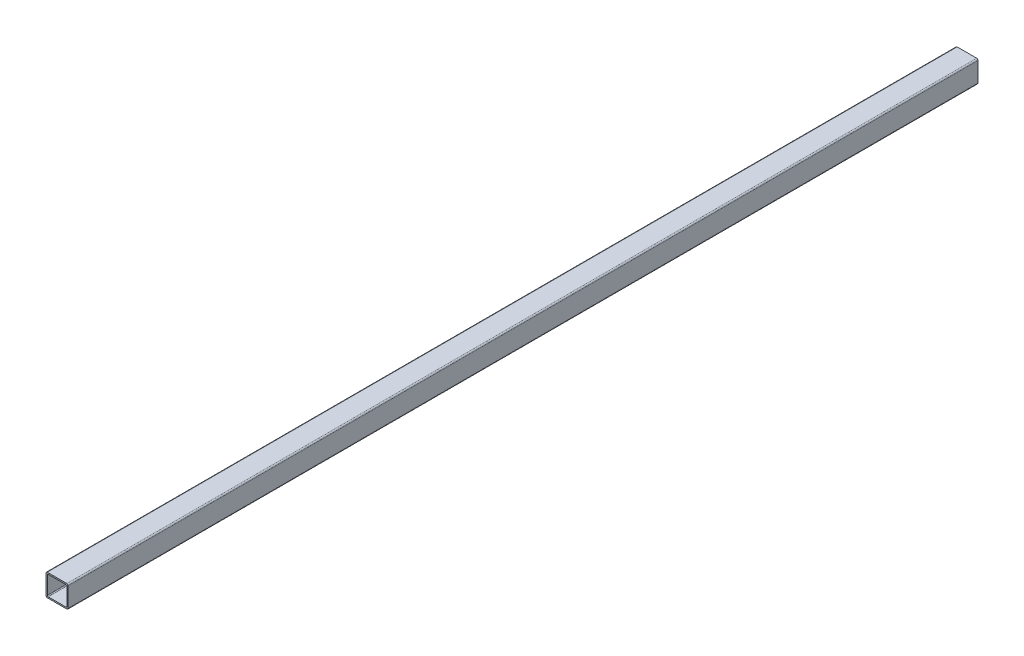
ISO-10303-21;
HEADER;
FILE_DESCRIPTION(('STEP AP214'),'2;1');
FILE_NAME('part.step','',(''),(''),'','','');
FILE_SCHEMA(('AUTOMOTIVE_DESIGN { 1 0 10303 214 1 1 1 1 }'));
ENDSEC;
DATA;
#1=APPLICATION_CONTEXT('core data for automotive mechanical design processes');
#2=APPLICATION_PROTOCOL_DEFINITION('international standard','automotive_design',2000,#1);
#3=PRODUCT_CONTEXT('',#1,'mechanical');
#4=PRODUCT('Part','Part','',(#3));
#5=PRODUCT_RELATED_PRODUCT_CATEGORY('part','',(#4));
#6=PRODUCT_DEFINITION_FORMATION('','',#4);
#7=PRODUCT_DEFINITION_CONTEXT('part definition',#1,'design');
#8=PRODUCT_DEFINITION('design','',#6,#7);
#9=PRODUCT_DEFINITION_SHAPE('','',#8);
#10=(LENGTH_UNIT() NAMED_UNIT(*) SI_UNIT(.MILLI.,.METRE.));
#11=(NAMED_UNIT(*) PLANE_ANGLE_UNIT() SI_UNIT($,.RADIAN.));
#12=(NAMED_UNIT(*) SI_UNIT($,.STERADIAN.) SOLID_ANGLE_UNIT());
#13=UNCERTAINTY_MEASURE_WITH_UNIT(LENGTH_MEASURE(1.E-05),#10,'distance_accuracy_value','');
#14=(GEOMETRIC_REPRESENTATION_CONTEXT(3) GLOBAL_UNCERTAINTY_ASSIGNED_CONTEXT((#13)) GLOBAL_UNIT_ASSIGNED_CONTEXT((#10,
#11,#12)) REPRESENTATION_CONTEXT('',''));
#15=CARTESIAN_POINT('',(0.,0.,0.));
#16=DIRECTION('',(0.,0.,1.));
#17=DIRECTION('',(1.,0.,0.));
#18=AXIS2_PLACEMENT_3D('',#15,#16,#17);
#19=CARTESIAN_POINT('',(-22.,-22.,-2054.3306612069));
#20=DIRECTION('',(0.,0.,1.));
#21=DIRECTION('',(1.,0.,0.));
#22=AXIS2_PLACEMENT_3D('',#19,#20,#21);
#23=CYLINDRICAL_SURFACE('',#22,3.);
#24=CARTESIAN_POINT('',(-22.,-22.,0.));
#25=DIRECTION('',(0.,0.,1.));
#26=DIRECTION('',(1.,0.,0.));
#27=AXIS2_PLACEMENT_3D('',#24,#25,#26);
#28=CIRCLE('',#27,3.);
#29=CARTESIAN_POINT('',(-25.,-22.,0.));
#30=VERTEX_POINT('',#29);
#31=CARTESIAN_POINT('',(-22.,-25.,0.));
#32=VERTEX_POINT('',#31);
#33=EDGE_CURVE('E205',#30,#32,#28,.T.);
#34=ORIENTED_EDGE('',*,*,#33,.F.);
#35=DIRECTION('',(0.,0.,1.));
#36=VECTOR('',#35,1.);
#37=CARTESIAN_POINT('',(-25.,-22.,-2054.3306612069));
#38=LINE('',#37,#36);
#39=CARTESIAN_POINT('',(-25.,-22.,-2054.3306612069));
#40=VERTEX_POINT('',#39);
#41=EDGE_CURVE('E11',#40,#30,#38,.T.);
#42=ORIENTED_EDGE('',*,*,#41,.F.);
#43=CARTESIAN_POINT('',(-22.,-22.,-2054.3306612069));
#44=DIRECTION('',(0.,0.,1.));
#45=DIRECTION('',(1.,0.,0.));
#46=AXIS2_PLACEMENT_3D('',#43,#44,#45);
#47=CIRCLE('',#46,3.);
#48=CARTESIAN_POINT('',(-22.,-25.,-2054.3306612069));
#49=VERTEX_POINT('',#48);
#50=EDGE_CURVE('E217',#40,#49,#47,.T.);
#51=ORIENTED_EDGE('',*,*,#50,.T.);
#52=DIRECTION('',(0.,0.,1.));
#53=VECTOR('',#52,1.);
#54=CARTESIAN_POINT('',(-22.,-25.,-2054.3306612069));
#55=LINE('',#54,#53);
#56=EDGE_CURVE('E38',#49,#32,#55,.T.);
#57=ORIENTED_EDGE('',*,*,#56,.T.);
#58=EDGE_LOOP('',(#34,#42,#51,#57));
#59=FACE_BOUND('',#58,.T.);
#60=ADVANCED_FACE('F35',(#59),#23,.T.);
#61=CARTESIAN_POINT('',(-25.,22.,-2054.3306612069));
#62=DIRECTION('',(-1.,0.,0.));
#63=DIRECTION('',(0.,0.,1.));
#64=AXIS2_PLACEMENT_3D('',#61,#62,#63);
#65=PLANE('',#64);
#66=DIRECTION('',(0.,-1.,0.));
#67=VECTOR('',#66,1.);
#68=CARTESIAN_POINT('',(-25.,22.,0.));
#69=LINE('',#68,#67);
#70=CARTESIAN_POINT('',(-25.,22.,0.));
#71=VERTEX_POINT('',#70);
#72=EDGE_CURVE('E221',#71,#30,#69,.T.);
#73=ORIENTED_EDGE('',*,*,#72,.F.);
#74=DIRECTION('',(0.,0.,1.));
#75=VECTOR('',#74,1.);
#76=CARTESIAN_POINT('',(-25.,22.,-2054.3306612069));
#77=LINE('',#76,#75);
#78=CARTESIAN_POINT('',(-25.,22.,-2054.3306612069));
#79=VERTEX_POINT('',#78);
#80=EDGE_CURVE('E43',#79,#71,#77,.T.);
#81=ORIENTED_EDGE('',*,*,#80,.F.);
#82=DIRECTION('',(0.,-1.,0.));
#83=VECTOR('',#82,1.);
#84=CARTESIAN_POINT('',(-25.,22.,-2054.3306612069));
#85=LINE('',#84,#83);
#86=EDGE_CURVE('E239',#79,#40,#85,.T.);
#87=ORIENTED_EDGE('',*,*,#86,.T.);
#88=ORIENTED_EDGE('',*,*,#41,.T.);
#89=EDGE_LOOP('',(#73,#81,#87,#88));
#90=FACE_BOUND('',#89,.T.);
#91=ADVANCED_FACE('F286',(#90),#65,.T.);
#92=CARTESIAN_POINT('',(-22.,22.,-2054.3306612069));
#93=DIRECTION('',(0.,0.,1.));
#94=DIRECTION('',(1.,0.,0.));
#95=AXIS2_PLACEMENT_3D('',#92,#93,#94);
#96=CYLINDRICAL_SURFACE('',#95,3.);
#97=CARTESIAN_POINT('',(-22.,22.,0.));
#98=DIRECTION('',(0.,0.,1.));
#99=DIRECTION('',(1.,0.,0.));
#100=AXIS2_PLACEMENT_3D('',#97,#98,#99);
#101=CIRCLE('',#100,3.);
#102=CARTESIAN_POINT('',(-22.,25.,0.));
#103=VERTEX_POINT('',#102);
#104=EDGE_CURVE('E259',#103,#71,#101,.T.);
#105=ORIENTED_EDGE('',*,*,#104,.F.);
#106=DIRECTION('',(0.,0.,1.));
#107=VECTOR('',#106,1.);
#108=CARTESIAN_POINT('',(-22.,25.,-2054.3306612069));
#109=LINE('',#108,#107);
#110=CARTESIAN_POINT('',(-22.,25.,-2054.3306612069));
#111=VERTEX_POINT('',#110);
#112=EDGE_CURVE('E265',#111,#103,#109,.T.);
#113=ORIENTED_EDGE('',*,*,#112,.F.);
#114=CARTESIAN_POINT('',(-22.,22.,-2054.3306612069));
#115=DIRECTION('',(0.,0.,1.));
#116=DIRECTION('',(1.,0.,0.));
#117=AXIS2_PLACEMENT_3D('',#114,#115,#116);
#118=CIRCLE('',#117,3.);
#119=EDGE_CURVE('E236',#111,#79,#118,.T.);
#120=ORIENTED_EDGE('',*,*,#119,.T.);
#121=ORIENTED_EDGE('',*,*,#80,.T.);
#122=EDGE_LOOP('',(#105,#113,#120,#121));
#123=FACE_BOUND('',#122,.T.);
#124=ADVANCED_FACE('F305',(#123),#96,.T.);
#125=CARTESIAN_POINT('',(-22.,25.,-2054.3306612069));
#126=DIRECTION('',(0.,1.,0.));
#127=DIRECTION('',(-1.,0.,0.));
#128=AXIS2_PLACEMENT_3D('',#125,#126,#127);
#129=PLANE('',#128);
#130=DIRECTION('',(-1.,0.,0.));
#131=VECTOR('',#130,1.);
#132=CARTESIAN_POINT('',(-22.,25.,0.));
#133=LINE('',#132,#131);
#134=CARTESIAN_POINT('',(22.,25.,0.));
#135=VERTEX_POINT('',#134);
#136=EDGE_CURVE('E256',#135,#103,#133,.T.);
#137=ORIENTED_EDGE('',*,*,#136,.F.);
#138=DIRECTION('',(0.,0.,1.));
#139=VECTOR('',#138,1.);
#140=CARTESIAN_POINT('',(22.,25.,-2054.3306612069));
#141=LINE('',#140,#139);
#142=CARTESIAN_POINT('',(22.,25.,-2054.3306612069));
#143=VERTEX_POINT('',#142);
#144=EDGE_CURVE('E267',#143,#135,#141,.T.);
#145=ORIENTED_EDGE('',*,*,#144,.F.);
#146=DIRECTION('',(-1.,0.,0.));
#147=VECTOR('',#146,1.);
#148=CARTESIAN_POINT('',(-22.,25.,-2054.3306612069));
#149=LINE('',#148,#147);
#150=EDGE_CURVE('E233',#143,#111,#149,.T.);
#151=ORIENTED_EDGE('',*,*,#150,.T.);
#152=ORIENTED_EDGE('',*,*,#112,.T.);
#153=EDGE_LOOP('',(#137,#145,#151,#152));
#154=FACE_BOUND('',#153,.T.);
#155=ADVANCED_FACE('F303',(#154),#129,.T.);
#156=CARTESIAN_POINT('',(22.,22.,-2054.3306612069));
#157=DIRECTION('',(0.,0.,1.));
#158=DIRECTION('',(1.,0.,0.));
#159=AXIS2_PLACEMENT_3D('',#156,#157,#158);
#160=CYLINDRICAL_SURFACE('',#159,3.00000000000001);
#161=CARTESIAN_POINT('',(22.,22.,0.));
#162=DIRECTION('',(0.,0.,1.));
#163=DIRECTION('',(-1.,0.,0.));
#164=AXIS2_PLACEMENT_3D('',#161,#162,#163);
#165=CIRCLE('',#164,3.00000000000001);
#166=CARTESIAN_POINT('',(25.,22.,0.));
#167=VERTEX_POINT('',#166);
#168=EDGE_CURVE('E253',#167,#135,#165,.T.);
#169=ORIENTED_EDGE('',*,*,#168,.F.);
#170=DIRECTION('',(0.,0.,1.));
#171=VECTOR('',#170,1.);
#172=CARTESIAN_POINT('',(25.,22.,-2054.3306612069));
#173=LINE('',#172,#171);
#174=CARTESIAN_POINT('',(25.,22.,-2054.3306612069));
#175=VERTEX_POINT('',#174);
#176=EDGE_CURVE('E269',#175,#167,#173,.T.);
#177=ORIENTED_EDGE('',*,*,#176,.F.);
#178=CARTESIAN_POINT('',(22.,22.,-2054.3306612069));
#179=DIRECTION('',(0.,0.,1.));
#180=DIRECTION('',(-1.,0.,0.));
#181=AXIS2_PLACEMENT_3D('',#178,#179,#180);
#182=CIRCLE('',#181,3.00000000000001);
#183=EDGE_CURVE('E230',#175,#143,#182,.T.);
#184=ORIENTED_EDGE('',*,*,#183,.T.);
#185=ORIENTED_EDGE('',*,*,#144,.T.);
#186=EDGE_LOOP('',(#169,#177,#184,#185));
#187=FACE_BOUND('',#186,.T.);
#188=ADVANCED_FACE('F299',(#187),#160,.T.);
#189=CARTESIAN_POINT('',(25.,22.,-2054.3306612069));
#190=DIRECTION('',(1.,0.,0.));
#191=DIRECTION('',(0.,0.,-1.));
#192=AXIS2_PLACEMENT_3D('',#189,#190,#191);
#193=PLANE('',#192);
#194=DIRECTION('',(0.,1.,0.));
#195=VECTOR('',#194,1.);
#196=CARTESIAN_POINT('',(25.,22.,0.));
#197=LINE('',#196,#195);
#198=CARTESIAN_POINT('',(25.,-22.,0.));
#199=VERTEX_POINT('',#198);
#200=EDGE_CURVE('E250',#199,#167,#197,.T.);
#201=ORIENTED_EDGE('',*,*,#200,.F.);
#202=DIRECTION('',(0.,0.,1.));
#203=VECTOR('',#202,1.);
#204=CARTESIAN_POINT('',(25.,-22.,-2054.3306612069));
#205=LINE('',#204,#203);
#206=CARTESIAN_POINT('',(25.,-22.,-2054.3306612069));
#207=VERTEX_POINT('',#206);
#208=EDGE_CURVE('E271',#207,#199,#205,.T.);
#209=ORIENTED_EDGE('',*,*,#208,.F.);
#210=DIRECTION('',(0.,1.,0.));
#211=VECTOR('',#210,1.);
#212=CARTESIAN_POINT('',(25.,22.,-2054.3306612069));
#213=LINE('',#212,#211);
#214=EDGE_CURVE('E227',#207,#175,#213,.T.);
#215=ORIENTED_EDGE('',*,*,#214,.T.);
#216=ORIENTED_EDGE('',*,*,#176,.T.);
#217=EDGE_LOOP('',(#201,#209,#215,#216));
#218=FACE_BOUND('',#217,.T.);
#219=ADVANCED_FACE('F297',(#218),#193,.T.);
#220=CARTESIAN_POINT('',(22.,-22.,-2054.3306612069));
#221=DIRECTION('',(0.,0.,1.));
#222=DIRECTION('',(1.,0.,0.));
#223=AXIS2_PLACEMENT_3D('',#220,#221,#222);
#224=CYLINDRICAL_SURFACE('',#223,3.);
#225=CARTESIAN_POINT('',(22.,-22.,0.));
#226=DIRECTION('',(0.,0.,1.));
#227=DIRECTION('',(1.,0.,0.));
#228=AXIS2_PLACEMENT_3D('',#225,#226,#227);
#229=CIRCLE('',#228,3.);
#230=CARTESIAN_POINT('',(22.,-25.,0.));
#231=VERTEX_POINT('',#230);
#232=EDGE_CURVE('E247',#231,#199,#229,.T.);
#233=ORIENTED_EDGE('',*,*,#232,.F.);
#234=DIRECTION('',(0.,0.,1.));
#235=VECTOR('',#234,1.);
#236=CARTESIAN_POINT('',(22.,-25.,-2054.3306612069));
#237=LINE('',#236,#235);
#238=CARTESIAN_POINT('',(22.,-25.,-2054.3306612069));
#239=VERTEX_POINT('',#238);
#240=EDGE_CURVE('E272',#239,#231,#237,.T.);
#241=ORIENTED_EDGE('',*,*,#240,.F.);
#242=CARTESIAN_POINT('',(22.,-22.,-2054.3306612069));
#243=DIRECTION('',(0.,0.,1.));
#244=DIRECTION('',(1.,0.,0.));
#245=AXIS2_PLACEMENT_3D('',#242,#243,#244);
#246=CIRCLE('',#245,3.);
#247=EDGE_CURVE('E224',#239,#207,#246,.T.);
#248=ORIENTED_EDGE('',*,*,#247,.T.);
#249=ORIENTED_EDGE('',*,*,#208,.T.);
#250=EDGE_LOOP('',(#233,#241,#248,#249));
#251=FACE_BOUND('',#250,.T.);
#252=ADVANCED_FACE('F293',(#251),#224,.T.);
#253=CARTESIAN_POINT('',(-22.,-25.,-2054.3306612069));
#254=DIRECTION('',(0.,-1.,0.));
#255=DIRECTION('',(0.,0.,-1.));
#256=AXIS2_PLACEMENT_3D('',#253,#254,#255);
#257=PLANE('',#256);
#258=DIRECTION('',(1.,0.,0.));
#259=VECTOR('',#258,1.);
#260=CARTESIAN_POINT('',(-22.,-25.,0.));
#261=LINE('',#260,#259);
#262=EDGE_CURVE('E244',#32,#231,#261,.T.);
#263=ORIENTED_EDGE('',*,*,#262,.F.);
#264=ORIENTED_EDGE('',*,*,#56,.F.);
#265=DIRECTION('',(1.,0.,0.));
#266=VECTOR('',#265,1.);
#267=CARTESIAN_POINT('',(-22.,-25.,-2054.3306612069));
#268=LINE('',#267,#266);
#269=EDGE_CURVE('E220',#49,#239,#268,.T.);
#270=ORIENTED_EDGE('',*,*,#269,.T.);
#271=ORIENTED_EDGE('',*,*,#240,.T.);
#272=EDGE_LOOP('',(#263,#264,#270,#271));
#273=FACE_BOUND('',#272,.T.);
#274=ADVANCED_FACE('F280',(#273),#257,.T.);
#275=CARTESIAN_POINT('',(-22.,-22.,-2054.3306612069));
#276=DIRECTION('',(0.,0.,1.));
#277=DIRECTION('',(1.,0.,0.));
#278=AXIS2_PLACEMENT_3D('',#275,#276,#277);
#279=PLANE('',#278);
#280=DIRECTION('',(0.,-1.,0.));
#281=VECTOR('',#280,1.);
#282=CARTESIAN_POINT('',(-22.,20.,-2054.3306612069));
#283=LINE('',#282,#281);
#284=CARTESIAN_POINT('',(-22.,20.,-2054.3306612069));
#285=VERTEX_POINT('',#284);
#286=CARTESIAN_POINT('',(-22.,-20.,-2054.3306612069));
#287=VERTEX_POINT('',#286);
#288=EDGE_CURVE('E156',#285,#287,#283,.T.);
#289=ORIENTED_EDGE('',*,*,#288,.T.);
#290=CARTESIAN_POINT('',(-20.,-20.,-2054.3306612069));
#291=DIRECTION('',(0.,0.,1.));
#292=DIRECTION('',(1.,0.,0.));
#293=AXIS2_PLACEMENT_3D('',#290,#291,#292);
#294=CIRCLE('',#293,2.);
#295=CARTESIAN_POINT('',(-20.,-22.,-2054.3306612069));
#296=VERTEX_POINT('',#295);
#297=EDGE_CURVE('E150',#287,#296,#294,.T.);
#298=ORIENTED_EDGE('',*,*,#297,.T.);
#299=DIRECTION('',(1.,0.,0.));
#300=VECTOR('',#299,1.);
#301=CARTESIAN_POINT('',(-20.,-22.,-2054.3306612069));
#302=LINE('',#301,#300);
#303=CARTESIAN_POINT('',(20.,-22.,-2054.3306612069));
#304=VERTEX_POINT('',#303);
#305=EDGE_CURVE('E159',#296,#304,#302,.T.);
#306=ORIENTED_EDGE('',*,*,#305,.T.);
#307=CARTESIAN_POINT('',(20.,-20.,-2054.3306612069));
#308=DIRECTION('',(0.,0.,1.));
#309=DIRECTION('',(1.,0.,0.));
#310=AXIS2_PLACEMENT_3D('',#307,#308,#309);
#311=CIRCLE('',#310,2.);
#312=CARTESIAN_POINT('',(22.,-20.,-2054.3306612069));
#313=VERTEX_POINT('',#312);
#314=EDGE_CURVE('E51',#304,#313,#311,.T.);
#315=ORIENTED_EDGE('',*,*,#314,.T.);
#316=DIRECTION('',(0.,1.,0.));
#317=VECTOR('',#316,1.);
#318=CARTESIAN_POINT('',(22.,20.,-2054.3306612069));
#319=LINE('',#318,#317);
#320=CARTESIAN_POINT('',(22.,20.,-2054.3306612069));
#321=VERTEX_POINT('',#320);
#322=EDGE_CURVE('E174',#313,#321,#319,.T.);
#323=ORIENTED_EDGE('',*,*,#322,.T.);
#324=CARTESIAN_POINT('',(20.,20.,-2054.3306612069));
#325=DIRECTION('',(0.,0.,1.));
#326=DIRECTION('',(-1.,0.,0.));
#327=AXIS2_PLACEMENT_3D('',#324,#325,#326);
#328=CIRCLE('',#327,2.);
#329=CARTESIAN_POINT('',(20.,22.,-2054.3306612069));
#330=VERTEX_POINT('',#329);
#331=EDGE_CURVE('E177',#321,#330,#328,.T.);
#332=ORIENTED_EDGE('',*,*,#331,.T.);
#333=DIRECTION('',(-1.,0.,0.));
#334=VECTOR('',#333,1.);
#335=CARTESIAN_POINT('',(-20.,22.,-2054.3306612069));
#336=LINE('',#335,#334);
#337=CARTESIAN_POINT('',(-20.,22.,-2054.3306612069));
#338=VERTEX_POINT('',#337);
#339=EDGE_CURVE('E180',#330,#338,#336,.T.);
#340=ORIENTED_EDGE('',*,*,#339,.T.);
#341=CARTESIAN_POINT('',(-20.,20.,-2054.3306612069));
#342=DIRECTION('',(0.,0.,1.));
#343=DIRECTION('',(1.,0.,0.));
#344=AXIS2_PLACEMENT_3D('',#341,#342,#343);
#345=CIRCLE('',#344,2.);
#346=EDGE_CURVE('E183',#338,#285,#345,.T.);
#347=ORIENTED_EDGE('',*,*,#346,.T.);
#348=EDGE_LOOP('',(#289,#298,#306,#315,#323,#332,#340,#347));
#349=FACE_BOUND('',#348,.T.);
#350=ORIENTED_EDGE('',*,*,#50,.F.);
#351=ORIENTED_EDGE('',*,*,#86,.F.);
#352=ORIENTED_EDGE('',*,*,#119,.F.);
#353=ORIENTED_EDGE('',*,*,#150,.F.);
#354=ORIENTED_EDGE('',*,*,#183,.F.);
#355=ORIENTED_EDGE('',*,*,#214,.F.);
#356=ORIENTED_EDGE('',*,*,#247,.F.);
#357=ORIENTED_EDGE('',*,*,#269,.F.);
#358=EDGE_LOOP('',(#350,#351,#352,#353,#354,#355,#356,#357));
#359=FACE_BOUND('',#358,.T.);
#360=ADVANCED_FACE('F163',(#349,#359),#279,.F.);
#361=CARTESIAN_POINT('',(-22.,-22.,0.));
#362=DIRECTION('',(0.,0.,1.));
#363=DIRECTION('',(1.,0.,0.));
#364=AXIS2_PLACEMENT_3D('',#361,#362,#363);
#365=PLANE('',#364);
#366=CARTESIAN_POINT('',(-20.,-20.,0.));
#367=DIRECTION('',(0.,0.,1.));
#368=DIRECTION('',(1.,0.,0.));
#369=AXIS2_PLACEMENT_3D('',#366,#367,#368);
#370=CIRCLE('',#369,2.);
#371=CARTESIAN_POINT('',(-22.,-20.,0.));
#372=VERTEX_POINT('',#371);
#373=CARTESIAN_POINT('',(-20.,-22.,0.));
#374=VERTEX_POINT('',#373);
#375=EDGE_CURVE('E59',#372,#374,#370,.T.);
#376=ORIENTED_EDGE('',*,*,#375,.F.);
#377=DIRECTION('',(0.,-1.,0.));
#378=VECTOR('',#377,1.);
#379=CARTESIAN_POINT('',(-22.,20.,0.));
#380=LINE('',#379,#378);
#381=CARTESIAN_POINT('',(-22.,20.,0.));
#382=VERTEX_POINT('',#381);
#383=EDGE_CURVE('E167',#382,#372,#380,.T.);
#384=ORIENTED_EDGE('',*,*,#383,.F.);
#385=CARTESIAN_POINT('',(-20.,20.,0.));
#386=DIRECTION('',(0.,0.,1.));
#387=DIRECTION('',(1.,0.,0.));
#388=AXIS2_PLACEMENT_3D('',#385,#386,#387);
#389=CIRCLE('',#388,2.);
#390=CARTESIAN_POINT('',(-20.,22.,0.));
#391=VERTEX_POINT('',#390);
#392=EDGE_CURVE('E170',#391,#382,#389,.T.);
#393=ORIENTED_EDGE('',*,*,#392,.F.);
#394=DIRECTION('',(-1.,0.,0.));
#395=VECTOR('',#394,1.);
#396=CARTESIAN_POINT('',(-20.,22.,0.));
#397=LINE('',#396,#395);
#398=CARTESIAN_POINT('',(20.,22.,0.));
#399=VERTEX_POINT('',#398);
#400=EDGE_CURVE('E198',#399,#391,#397,.T.);
#401=ORIENTED_EDGE('',*,*,#400,.F.);
#402=CARTESIAN_POINT('',(20.,20.,0.));
#403=DIRECTION('',(0.,0.,1.));
#404=DIRECTION('',(-1.,0.,0.));
#405=AXIS2_PLACEMENT_3D('',#402,#403,#404);
#406=CIRCLE('',#405,2.);
#407=CARTESIAN_POINT('',(22.,20.,0.));
#408=VERTEX_POINT('',#407);
#409=EDGE_CURVE('E195',#408,#399,#406,.T.);
#410=ORIENTED_EDGE('',*,*,#409,.F.);
#411=DIRECTION('',(0.,1.,0.));
#412=VECTOR('',#411,1.);
#413=CARTESIAN_POINT('',(22.,20.,0.));
#414=LINE('',#413,#412);
#415=CARTESIAN_POINT('',(22.,-20.,0.));
#416=VERTEX_POINT('',#415);
#417=EDGE_CURVE('E192',#416,#408,#414,.T.);
#418=ORIENTED_EDGE('',*,*,#417,.F.);
#419=CARTESIAN_POINT('',(20.,-20.,0.));
#420=DIRECTION('',(0.,0.,1.));
#421=DIRECTION('',(1.,0.,0.));
#422=AXIS2_PLACEMENT_3D('',#419,#420,#421);
#423=CIRCLE('',#422,2.);
#424=CARTESIAN_POINT('',(20.,-22.,0.));
#425=VERTEX_POINT('',#424);
#426=EDGE_CURVE('E189',#425,#416,#423,.T.);
#427=ORIENTED_EDGE('',*,*,#426,.F.);
#428=DIRECTION('',(1.,0.,0.));
#429=VECTOR('',#428,1.);
#430=CARTESIAN_POINT('',(-20.,-22.,0.));
#431=LINE('',#430,#429);
#432=EDGE_CURVE('E187',#374,#425,#431,.T.);
#433=ORIENTED_EDGE('',*,*,#432,.F.);
#434=EDGE_LOOP('',(#376,#384,#393,#401,#410,#418,#427,#433));
#435=FACE_BOUND('',#434,.T.);
#436=ORIENTED_EDGE('',*,*,#33,.T.);
#437=ORIENTED_EDGE('',*,*,#262,.T.);
#438=ORIENTED_EDGE('',*,*,#232,.T.);
#439=ORIENTED_EDGE('',*,*,#200,.T.);
#440=ORIENTED_EDGE('',*,*,#168,.T.);
#441=ORIENTED_EDGE('',*,*,#136,.T.);
#442=ORIENTED_EDGE('',*,*,#104,.T.);
#443=ORIENTED_EDGE('',*,*,#72,.T.);
#444=EDGE_LOOP('',(#436,#437,#438,#439,#440,#441,#442,#443));
#445=FACE_BOUND('',#444,.T.);
#446=ADVANCED_FACE('F282',(#435,#445),#365,.T.);
#447=CARTESIAN_POINT('',(-20.,-20.,-2054.3306612069));
#448=DIRECTION('',(0.,0.,1.));
#449=DIRECTION('',(1.,0.,0.));
#450=AXIS2_PLACEMENT_3D('',#447,#448,#449);
#451=CYLINDRICAL_SURFACE('',#450,2.);
#452=ORIENTED_EDGE('',*,*,#375,.T.);
#453=DIRECTION('',(0.,0.,1.));
#454=VECTOR('',#453,1.);
#455=CARTESIAN_POINT('',(-20.,-22.,-2054.3306612069));
#456=LINE('',#455,#454);
#457=EDGE_CURVE('E146',#296,#374,#456,.T.);
#458=ORIENTED_EDGE('',*,*,#457,.F.);
#459=ORIENTED_EDGE('',*,*,#297,.F.);
#460=DIRECTION('',(0.,0.,1.));
#461=VECTOR('',#460,1.);
#462=CARTESIAN_POINT('',(-22.,-20.,-2054.3306612069));
#463=LINE('',#462,#461);
#464=EDGE_CURVE('E203',#287,#372,#463,.T.);
#465=ORIENTED_EDGE('',*,*,#464,.T.);
#466=EDGE_LOOP('',(#452,#458,#459,#465));
#467=FACE_BOUND('',#466,.T.);
#468=ADVANCED_FACE('F148',(#467),#451,.F.);
#469=CARTESIAN_POINT('',(-22.,20.,-2054.3306612069));
#470=DIRECTION('',(-1.,0.,0.));
#471=DIRECTION('',(0.,0.,1.));
#472=AXIS2_PLACEMENT_3D('',#469,#470,#471);
#473=PLANE('',#472);
#474=ORIENTED_EDGE('',*,*,#383,.T.);
#475=ORIENTED_EDGE('',*,*,#464,.F.);
#476=ORIENTED_EDGE('',*,*,#288,.F.);
#477=DIRECTION('',(0.,0.,1.));
#478=VECTOR('',#477,1.);
#479=CARTESIAN_POINT('',(-22.,20.,-2054.3306612069));
#480=LINE('',#479,#478);
#481=EDGE_CURVE('E206',#285,#382,#480,.T.);
#482=ORIENTED_EDGE('',*,*,#481,.T.);
#483=EDGE_LOOP('',(#474,#475,#476,#482));
#484=FACE_BOUND('',#483,.T.);
#485=ADVANCED_FACE('F388',(#484),#473,.F.);
#486=CARTESIAN_POINT('',(-20.,20.,-2054.3306612069));
#487=DIRECTION('',(0.,0.,1.));
#488=DIRECTION('',(1.,0.,0.));
#489=AXIS2_PLACEMENT_3D('',#486,#487,#488);
#490=CYLINDRICAL_SURFACE('',#489,2.);
#491=ORIENTED_EDGE('',*,*,#392,.T.);
#492=ORIENTED_EDGE('',*,*,#481,.F.);
#493=ORIENTED_EDGE('',*,*,#346,.F.);
#494=DIRECTION('',(0.,0.,1.));
#495=VECTOR('',#494,1.);
#496=CARTESIAN_POINT('',(-20.,22.,-2054.3306612069));
#497=LINE('',#496,#495);
#498=EDGE_CURVE('E208',#338,#391,#497,.T.);
#499=ORIENTED_EDGE('',*,*,#498,.T.);
#500=EDGE_LOOP('',(#491,#492,#493,#499));
#501=FACE_BOUND('',#500,.T.);
#502=ADVANCED_FACE('F397',(#501),#490,.F.);
#503=CARTESIAN_POINT('',(-20.,22.,-2054.3306612069));
#504=DIRECTION('',(0.,1.,0.));
#505=DIRECTION('',(0.,0.,1.));
#506=AXIS2_PLACEMENT_3D('',#503,#504,#505);
#507=PLANE('',#506);
#508=ORIENTED_EDGE('',*,*,#400,.T.);
#509=ORIENTED_EDGE('',*,*,#498,.F.);
#510=ORIENTED_EDGE('',*,*,#339,.F.);
#511=DIRECTION('',(0.,0.,1.));
#512=VECTOR('',#511,1.);
#513=CARTESIAN_POINT('',(20.,22.,-2054.3306612069));
#514=LINE('',#513,#512);
#515=EDGE_CURVE('E210',#330,#399,#514,.T.);
#516=ORIENTED_EDGE('',*,*,#515,.T.);
#517=EDGE_LOOP('',(#508,#509,#510,#516));
#518=FACE_BOUND('',#517,.T.);
#519=ADVANCED_FACE('F407',(#518),#507,.F.);
#520=CARTESIAN_POINT('',(20.,20.,-2054.3306612069));
#521=DIRECTION('',(0.,0.,1.));
#522=DIRECTION('',(1.,0.,0.));
#523=AXIS2_PLACEMENT_3D('',#520,#521,#522);
#524=CYLINDRICAL_SURFACE('',#523,2.);
#525=ORIENTED_EDGE('',*,*,#409,.T.);
#526=ORIENTED_EDGE('',*,*,#515,.F.);
#527=ORIENTED_EDGE('',*,*,#331,.F.);
#528=DIRECTION('',(0.,0.,1.));
#529=VECTOR('',#528,1.);
#530=CARTESIAN_POINT('',(22.,20.,-2054.3306612069));
#531=LINE('',#530,#529);
#532=EDGE_CURVE('E212',#321,#408,#531,.T.);
#533=ORIENTED_EDGE('',*,*,#532,.T.);
#534=EDGE_LOOP('',(#525,#526,#527,#533));
#535=FACE_BOUND('',#534,.T.);
#536=ADVANCED_FACE('F417',(#535),#524,.F.);
#537=CARTESIAN_POINT('',(22.,20.,-2054.3306612069));
#538=DIRECTION('',(1.,0.,0.));
#539=DIRECTION('',(0.,0.,-1.));
#540=AXIS2_PLACEMENT_3D('',#537,#538,#539);
#541=PLANE('',#540);
#542=ORIENTED_EDGE('',*,*,#417,.T.);
#543=ORIENTED_EDGE('',*,*,#532,.F.);
#544=ORIENTED_EDGE('',*,*,#322,.F.);
#545=DIRECTION('',(0.,0.,1.));
#546=VECTOR('',#545,1.);
#547=CARTESIAN_POINT('',(22.,-20.,-2054.3306612069));
#548=LINE('',#547,#546);
#549=EDGE_CURVE('E214',#313,#416,#548,.T.);
#550=ORIENTED_EDGE('',*,*,#549,.T.);
#551=EDGE_LOOP('',(#542,#543,#544,#550));
#552=FACE_BOUND('',#551,.T.);
#553=ADVANCED_FACE('F427',(#552),#541,.F.);
#554=CARTESIAN_POINT('',(20.,-20.,-2054.3306612069));
#555=DIRECTION('',(0.,0.,1.));
#556=DIRECTION('',(1.,0.,0.));
#557=AXIS2_PLACEMENT_3D('',#554,#555,#556);
#558=CYLINDRICAL_SURFACE('',#557,2.);
#559=ORIENTED_EDGE('',*,*,#426,.T.);
#560=ORIENTED_EDGE('',*,*,#549,.F.);
#561=ORIENTED_EDGE('',*,*,#314,.F.);
#562=DIRECTION('',(0.,0.,1.));
#563=VECTOR('',#562,1.);
#564=CARTESIAN_POINT('',(20.,-22.,-2054.3306612069));
#565=LINE('',#564,#563);
#566=EDGE_CURVE('E155',#304,#425,#565,.T.);
#567=ORIENTED_EDGE('',*,*,#566,.T.);
#568=EDGE_LOOP('',(#559,#560,#561,#567));
#569=FACE_BOUND('',#568,.T.);
#570=ADVANCED_FACE('F437',(#569),#558,.F.);
#571=CARTESIAN_POINT('',(-20.,-22.,-2054.3306612069));
#572=DIRECTION('',(0.,-1.,0.));
#573=DIRECTION('',(0.,0.,-1.));
#574=AXIS2_PLACEMENT_3D('',#571,#572,#573);
#575=PLANE('',#574);
#576=ORIENTED_EDGE('',*,*,#432,.T.);
#577=ORIENTED_EDGE('',*,*,#566,.F.);
#578=ORIENTED_EDGE('',*,*,#305,.F.);
#579=ORIENTED_EDGE('',*,*,#457,.T.);
#580=EDGE_LOOP('',(#576,#577,#578,#579));
#581=FACE_BOUND('',#580,.T.);
#582=ADVANCED_FACE('F160',(#581),#575,.F.);
#583=CLOSED_SHELL('',(#60,#91,#124,#155,#188,#219,#252,#274,#360,#446,#468,#485,#502,#519,#536,
#553,#570,#582));
#584=MANIFOLD_SOLID_BREP('B2',#583);
#585=ADVANCED_BREP_SHAPE_REPRESENTATION('',(#18,#584),#14);
#586=SHAPE_DEFINITION_REPRESENTATION(#9,#585);
ENDSEC;
END-ISO-10303-21;
